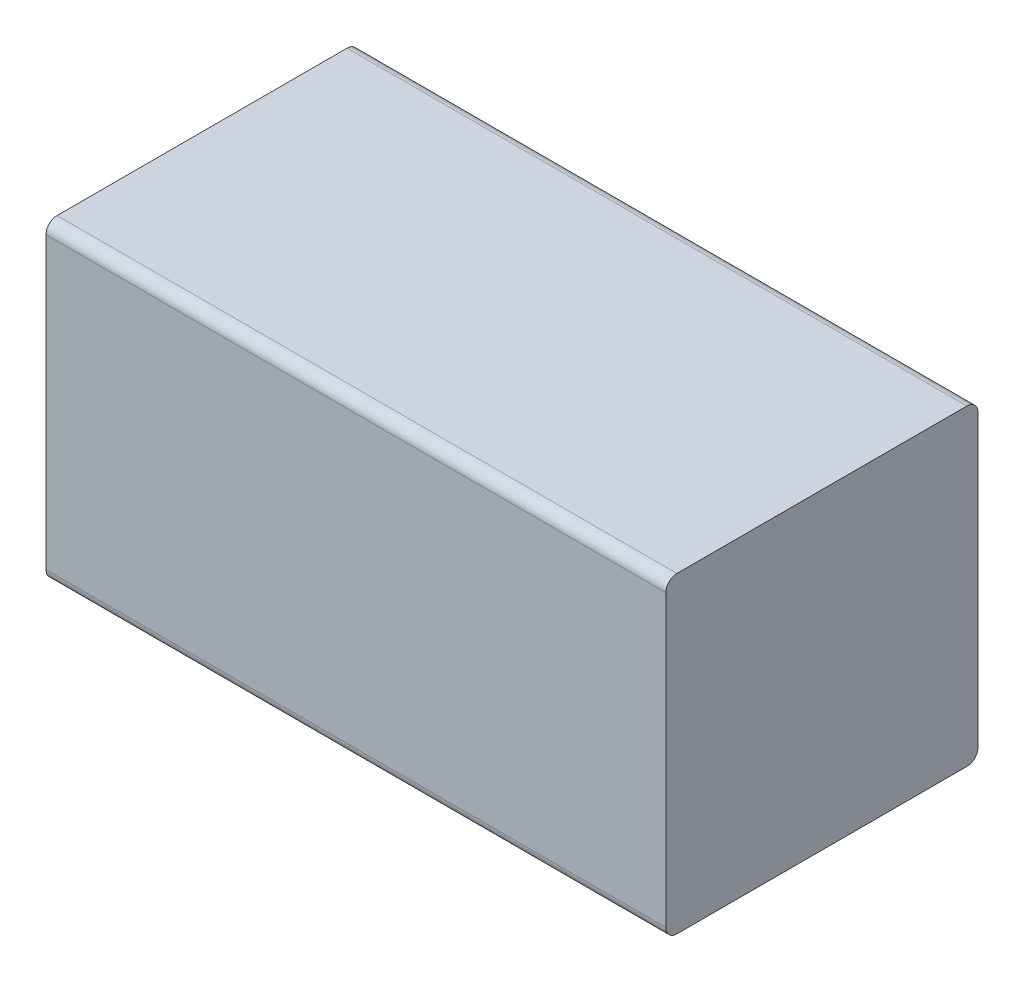
ISO-10303-21;
HEADER;
FILE_DESCRIPTION(('STEP AP214'),'2;1');
FILE_NAME('part.step','',(''),(''),'','','');
FILE_SCHEMA(('AUTOMOTIVE_DESIGN { 1 0 10303 214 1 1 1 1 }'));
ENDSEC;
DATA;
#1=APPLICATION_CONTEXT('core data for automotive mechanical design processes');
#2=APPLICATION_PROTOCOL_DEFINITION('international standard','automotive_design',2000,#1);
#3=PRODUCT_CONTEXT('',#1,'mechanical');
#4=PRODUCT('Part','Part','',(#3));
#5=PRODUCT_RELATED_PRODUCT_CATEGORY('part','',(#4));
#6=PRODUCT_DEFINITION_FORMATION('','',#4);
#7=PRODUCT_DEFINITION_CONTEXT('part definition',#1,'design');
#8=PRODUCT_DEFINITION('design','',#6,#7);
#9=PRODUCT_DEFINITION_SHAPE('','',#8);
#10=(LENGTH_UNIT() NAMED_UNIT(*) SI_UNIT(.MILLI.,.METRE.));
#11=(NAMED_UNIT(*) PLANE_ANGLE_UNIT() SI_UNIT($,.RADIAN.));
#12=(NAMED_UNIT(*) SI_UNIT($,.STERADIAN.) SOLID_ANGLE_UNIT());
#13=UNCERTAINTY_MEASURE_WITH_UNIT(LENGTH_MEASURE(1.E-05),#10,'distance_accuracy_value','');
#14=(GEOMETRIC_REPRESENTATION_CONTEXT(3) GLOBAL_UNCERTAINTY_ASSIGNED_CONTEXT((#13)) GLOBAL_UNIT_ASSIGNED_CONTEXT((#10,
#11,#12)) REPRESENTATION_CONTEXT('',''));
#15=CARTESIAN_POINT('',(0.,0.,0.));
#16=DIRECTION('',(0.,0.,1.));
#17=DIRECTION('',(1.,0.,0.));
#18=AXIS2_PLACEMENT_3D('',#15,#16,#17);
#19=CARTESIAN_POINT('',(-56.,56.4,28.2));
#20=DIRECTION('',(1.,0.,0.));
#21=DIRECTION('',(0.,0.,-1.));
#22=AXIS2_PLACEMENT_3D('',#19,#20,#21);
#23=PLANE('',#22);
#24=CARTESIAN_POINT('',(-56.,51.7,-23.5));
#25=DIRECTION('',(-1.,0.,0.));
#26=DIRECTION('',(0.,0.,1.));
#27=AXIS2_PLACEMENT_3D('',#24,#25,#26);
#28=CIRCLE('',#27,2.49999999999999);
#29=CARTESIAN_POINT('',(-56.,51.7,-21.));
#30=VERTEX_POINT('',#29);
#31=EDGE_CURVE('E264',#30,#30,#28,.T.);
#32=ORIENTED_EDGE('',*,*,#31,.F.);
#33=EDGE_LOOP('',(#32));
#34=FACE_BOUND('',#33,.T.);
#35=CARTESIAN_POINT('',(-56.,51.7,23.5));
#36=DIRECTION('',(-1.,0.,0.));
#37=DIRECTION('',(0.,0.,1.));
#38=AXIS2_PLACEMENT_3D('',#35,#36,#37);
#39=CIRCLE('',#38,2.49999999999999);
#40=CARTESIAN_POINT('',(-56.,51.7,26.));
#41=VERTEX_POINT('',#40);
#42=EDGE_CURVE('E266',#41,#41,#39,.T.);
#43=ORIENTED_EDGE('',*,*,#42,.F.);
#44=EDGE_LOOP('',(#43));
#45=FACE_BOUND('',#44,.T.);
#46=CARTESIAN_POINT('',(-56.,4.70000003606839,23.5018413119319));
#47=DIRECTION('',(-1.,0.,0.));
#48=DIRECTION('',(0.,0.,1.));
#49=AXIS2_PLACEMENT_3D('',#46,#47,#48);
#50=CIRCLE('',#49,2.49999999999999);
#51=CARTESIAN_POINT('',(-56.,4.70000003606839,26.0018413119319));
#52=VERTEX_POINT('',#51);
#53=EDGE_CURVE('E274',#52,#52,#50,.T.);
#54=ORIENTED_EDGE('',*,*,#53,.F.);
#55=EDGE_LOOP('',(#54));
#56=FACE_BOUND('',#55,.T.);
#57=CARTESIAN_POINT('',(-56.,28.2,0.));
#58=DIRECTION('',(1.,0.,0.));
#59=DIRECTION('',(0.,0.,-1.));
#60=AXIS2_PLACEMENT_3D('',#57,#58,#59);
#61=CIRCLE('',#60,4.);
#62=CARTESIAN_POINT('',(-56.,28.2,-4.));
#63=VERTEX_POINT('',#62);
#64=EDGE_CURVE('E12',#63,#63,#61,.F.);
#65=ORIENTED_EDGE('',*,*,#64,.F.);
#66=EDGE_LOOP('',(#65));
#67=FACE_BOUND('',#66,.T.);
#68=DIRECTION('',(0.,0.,1.));
#69=VECTOR('',#68,1.);
#70=CARTESIAN_POINT('',(-56.,56.4,28.2));
#71=LINE('',#70,#69);
#72=CARTESIAN_POINT('',(-56.,56.4,-26.2));
#73=VERTEX_POINT('',#72);
#74=CARTESIAN_POINT('',(-56.,56.4,26.2));
#75=VERTEX_POINT('',#74);
#76=EDGE_CURVE('E115',#73,#75,#71,.T.);
#77=ORIENTED_EDGE('',*,*,#76,.F.);
#78=CARTESIAN_POINT('',(-56.,54.4,-26.2));
#79=DIRECTION('',(1.,0.,0.));
#80=DIRECTION('',(0.,0.,-1.));
#81=AXIS2_PLACEMENT_3D('',#78,#79,#80);
#82=CIRCLE('',#81,2.);
#83=CARTESIAN_POINT('',(-56.,54.4,-28.2));
#84=VERTEX_POINT('',#83);
#85=EDGE_CURVE('E152',#73,#84,#82,.F.);
#86=ORIENTED_EDGE('',*,*,#85,.T.);
#87=DIRECTION('',(0.,-1.,0.));
#88=VECTOR('',#87,1.);
#89=CARTESIAN_POINT('',(-56.,56.4,-28.2));
#90=LINE('',#89,#88);
#91=CARTESIAN_POINT('',(-56.,2.,-28.2));
#92=VERTEX_POINT('',#91);
#93=EDGE_CURVE('E140',#84,#92,#90,.T.);
#94=ORIENTED_EDGE('',*,*,#93,.T.);
#95=CARTESIAN_POINT('',(-56.,2.,-26.2));
#96=DIRECTION('',(1.,0.,0.));
#97=DIRECTION('',(0.,0.,-1.));
#98=AXIS2_PLACEMENT_3D('',#95,#96,#97);
#99=CIRCLE('',#98,2.);
#100=CARTESIAN_POINT('',(-56.,0.,-26.2));
#101=VERTEX_POINT('',#100);
#102=EDGE_CURVE('E150',#92,#101,#99,.F.);
#103=ORIENTED_EDGE('',*,*,#102,.T.);
#104=DIRECTION('',(0.,0.,1.));
#105=VECTOR('',#104,1.);
#106=CARTESIAN_POINT('',(-56.,0.,28.2));
#107=LINE('',#106,#105);
#108=CARTESIAN_POINT('',(-56.,0.,26.2));
#109=VERTEX_POINT('',#108);
#110=EDGE_CURVE('E123',#101,#109,#107,.T.);
#111=ORIENTED_EDGE('',*,*,#110,.T.);
#112=CARTESIAN_POINT('',(-56.,2.,26.2));
#113=DIRECTION('',(1.,0.,0.));
#114=DIRECTION('',(0.,0.,-1.));
#115=AXIS2_PLACEMENT_3D('',#112,#113,#114);
#116=CIRCLE('',#115,2.);
#117=CARTESIAN_POINT('',(-56.,2.,28.2));
#118=VERTEX_POINT('',#117);
#119=EDGE_CURVE('E148',#109,#118,#116,.F.);
#120=ORIENTED_EDGE('',*,*,#119,.T.);
#121=DIRECTION('',(0.,-1.,0.));
#122=VECTOR('',#121,1.);
#123=CARTESIAN_POINT('',(-56.,56.4,28.2));
#124=LINE('',#123,#122);
#125=CARTESIAN_POINT('',(-56.,54.4,28.2));
#126=VERTEX_POINT('',#125);
#127=EDGE_CURVE('E137',#126,#118,#124,.T.);
#128=ORIENTED_EDGE('',*,*,#127,.F.);
#129=CARTESIAN_POINT('',(-56.,54.4,26.2));
#130=DIRECTION('',(1.,0.,0.));
#131=DIRECTION('',(0.,0.,-1.));
#132=AXIS2_PLACEMENT_3D('',#129,#130,#131);
#133=CIRCLE('',#132,2.);
#134=EDGE_CURVE('E146',#126,#75,#133,.F.);
#135=ORIENTED_EDGE('',*,*,#134,.T.);
#136=EDGE_LOOP('',(#77,#86,#94,#103,#111,#120,#128,#135));
#137=FACE_BOUND('',#136,.T.);
#138=CARTESIAN_POINT('',(-56.,4.70000003606839,-23.4981586880681));
#139=DIRECTION('',(-1.,0.,0.));
#140=DIRECTION('',(0.,0.,1.));
#141=AXIS2_PLACEMENT_3D('',#138,#139,#140);
#142=CIRCLE('',#141,2.49999999999999);
#143=CARTESIAN_POINT('',(-56.,4.70000003606839,-20.9981586880681));
#144=VERTEX_POINT('',#143);
#145=EDGE_CURVE('E280',#144,#144,#142,.T.);
#146=ORIENTED_EDGE('',*,*,#145,.F.);
#147=EDGE_LOOP('',(#146));
#148=FACE_BOUND('',#147,.T.);
#149=ADVANCED_FACE('F34',(#34,#45,#56,#67,#137,#148),#23,.F.);
#150=CARTESIAN_POINT('',(56.,56.4,28.2));
#151=DIRECTION('',(-1.,0.,0.));
#152=DIRECTION('',(0.,0.,1.));
#153=AXIS2_PLACEMENT_3D('',#150,#151,#152);
#154=PLANE('',#153);
#155=DIRECTION('',(0.,-1.,0.));
#156=VECTOR('',#155,1.);
#157=CARTESIAN_POINT('',(56.,56.4,-28.2));
#158=LINE('',#157,#156);
#159=CARTESIAN_POINT('',(56.,54.4,-28.2));
#160=VERTEX_POINT('',#159);
#161=CARTESIAN_POINT('',(56.,2.,-28.2));
#162=VERTEX_POINT('',#161);
#163=EDGE_CURVE('E117',#160,#162,#158,.T.);
#164=ORIENTED_EDGE('',*,*,#163,.F.);
#165=CARTESIAN_POINT('',(56.,54.4,-26.2));
#166=DIRECTION('',(-1.,0.,0.));
#167=DIRECTION('',(0.,0.,1.));
#168=AXIS2_PLACEMENT_3D('',#165,#166,#167);
#169=CIRCLE('',#168,2.);
#170=CARTESIAN_POINT('',(56.,56.4,-26.2));
#171=VERTEX_POINT('',#170);
#172=EDGE_CURVE('E122',#160,#171,#169,.F.);
#173=ORIENTED_EDGE('',*,*,#172,.T.);
#174=DIRECTION('',(0.,0.,-1.));
#175=VECTOR('',#174,1.);
#176=CARTESIAN_POINT('',(56.,56.4,28.2));
#177=LINE('',#176,#175);
#178=CARTESIAN_POINT('',(56.,56.4,26.2));
#179=VERTEX_POINT('',#178);
#180=EDGE_CURVE('E112',#179,#171,#177,.T.);
#181=ORIENTED_EDGE('',*,*,#180,.F.);
#182=CARTESIAN_POINT('',(56.,54.4,26.2));
#183=DIRECTION('',(-1.,0.,0.));
#184=DIRECTION('',(0.,0.,1.));
#185=AXIS2_PLACEMENT_3D('',#182,#183,#184);
#186=CIRCLE('',#185,2.);
#187=CARTESIAN_POINT('',(56.,54.4,28.2));
#188=VERTEX_POINT('',#187);
#189=EDGE_CURVE('E57',#179,#188,#186,.F.);
#190=ORIENTED_EDGE('',*,*,#189,.T.);
#191=DIRECTION('',(0.,-1.,0.));
#192=VECTOR('',#191,1.);
#193=CARTESIAN_POINT('',(56.,56.4,28.2));
#194=LINE('',#193,#192);
#195=CARTESIAN_POINT('',(56.,2.,28.2));
#196=VERTEX_POINT('',#195);
#197=EDGE_CURVE('E125',#188,#196,#194,.T.);
#198=ORIENTED_EDGE('',*,*,#197,.T.);
#199=CARTESIAN_POINT('',(56.,2.,26.2));
#200=DIRECTION('',(-1.,0.,0.));
#201=DIRECTION('',(0.,0.,1.));
#202=AXIS2_PLACEMENT_3D('',#199,#200,#201);
#203=CIRCLE('',#202,2.);
#204=CARTESIAN_POINT('',(56.,0.,26.2));
#205=VERTEX_POINT('',#204);
#206=EDGE_CURVE('E49',#196,#205,#203,.F.);
#207=ORIENTED_EDGE('',*,*,#206,.T.);
#208=DIRECTION('',(0.,0.,-1.));
#209=VECTOR('',#208,1.);
#210=CARTESIAN_POINT('',(56.,0.,28.2));
#211=LINE('',#210,#209);
#212=CARTESIAN_POINT('',(56.,0.,-26.2));
#213=VERTEX_POINT('',#212);
#214=EDGE_CURVE('E128',#205,#213,#211,.T.);
#215=ORIENTED_EDGE('',*,*,#214,.T.);
#216=CARTESIAN_POINT('',(56.,2.,-26.2));
#217=DIRECTION('',(-1.,0.,0.));
#218=DIRECTION('',(0.,0.,1.));
#219=AXIS2_PLACEMENT_3D('',#216,#217,#218);
#220=CIRCLE('',#219,2.);
#221=EDGE_CURVE('E159',#213,#162,#220,.F.);
#222=ORIENTED_EDGE('',*,*,#221,.T.);
#223=EDGE_LOOP('',(#164,#173,#181,#190,#198,#207,#215,#222));
#224=FACE_BOUND('',#223,.T.);
#225=ADVANCED_FACE('F120',(#224),#154,.F.);
#226=CARTESIAN_POINT('',(-56.,56.4,-28.2));
#227=DIRECTION('',(0.,0.,1.));
#228=DIRECTION('',(1.,0.,0.));
#229=AXIS2_PLACEMENT_3D('',#226,#227,#228);
#230=PLANE('',#229);
#231=ORIENTED_EDGE('',*,*,#93,.F.);
#232=DIRECTION('',(-1.,0.,0.));
#233=VECTOR('',#232,1.);
#234=CARTESIAN_POINT('',(-56.,54.4,-28.2));
#235=LINE('',#234,#233);
#236=EDGE_CURVE('E105',#84,#160,#235,.F.);
#237=ORIENTED_EDGE('',*,*,#236,.T.);
#238=ORIENTED_EDGE('',*,*,#163,.T.);
#239=DIRECTION('',(-1.,0.,0.));
#240=VECTOR('',#239,1.);
#241=CARTESIAN_POINT('',(-56.,2.,-28.2));
#242=LINE('',#241,#240);
#243=EDGE_CURVE('E154',#162,#92,#242,.T.);
#244=ORIENTED_EDGE('',*,*,#243,.T.);
#245=EDGE_LOOP('',(#231,#237,#238,#244));
#246=FACE_BOUND('',#245,.T.);
#247=ADVANCED_FACE('F184',(#246),#230,.F.);
#248=CARTESIAN_POINT('',(-56.,56.4,28.2));
#249=DIRECTION('',(0.,0.,-1.));
#250=DIRECTION('',(-1.,0.,0.));
#251=AXIS2_PLACEMENT_3D('',#248,#249,#250);
#252=PLANE('',#251);
#253=ORIENTED_EDGE('',*,*,#127,.T.);
#254=DIRECTION('',(1.,0.,0.));
#255=VECTOR('',#254,1.);
#256=CARTESIAN_POINT('',(56.,2.,28.2));
#257=LINE('',#256,#255);
#258=EDGE_CURVE('E42',#118,#196,#257,.T.);
#259=ORIENTED_EDGE('',*,*,#258,.T.);
#260=ORIENTED_EDGE('',*,*,#197,.F.);
#261=DIRECTION('',(1.,0.,0.));
#262=VECTOR('',#261,1.);
#263=CARTESIAN_POINT('',(-56.,54.4,28.2));
#264=LINE('',#263,#262);
#265=EDGE_CURVE('E104',#188,#126,#264,.F.);
#266=ORIENTED_EDGE('',*,*,#265,.T.);
#267=EDGE_LOOP('',(#253,#259,#260,#266));
#268=FACE_BOUND('',#267,.T.);
#269=ADVANCED_FACE('F167',(#268),#252,.F.);
#270=CARTESIAN_POINT('',(0.,56.4,0.));
#271=DIRECTION('',(0.,-1.,0.));
#272=DIRECTION('',(0.,0.,-1.));
#273=AXIS2_PLACEMENT_3D('',#270,#271,#272);
#274=PLANE('',#273);
#275=ORIENTED_EDGE('',*,*,#180,.T.);
#276=DIRECTION('',(-1.,0.,0.));
#277=VECTOR('',#276,1.);
#278=CARTESIAN_POINT('',(0.,56.4,-26.2));
#279=LINE('',#278,#277);
#280=EDGE_CURVE('E116',#171,#73,#279,.T.);
#281=ORIENTED_EDGE('',*,*,#280,.T.);
#282=ORIENTED_EDGE('',*,*,#76,.T.);
#283=DIRECTION('',(1.,0.,0.));
#284=VECTOR('',#283,1.);
#285=CARTESIAN_POINT('',(0.,56.4,26.2));
#286=LINE('',#285,#284);
#287=EDGE_CURVE('E103',#75,#179,#286,.T.);
#288=ORIENTED_EDGE('',*,*,#287,.T.);
#289=EDGE_LOOP('',(#275,#281,#282,#288));
#290=FACE_BOUND('',#289,.T.);
#291=ADVANCED_FACE('F110',(#290),#274,.F.);
#292=CARTESIAN_POINT('',(0.,0.,0.));
#293=DIRECTION('',(0.,-1.,0.));
#294=DIRECTION('',(0.,0.,-1.));
#295=AXIS2_PLACEMENT_3D('',#292,#293,#294);
#296=PLANE('',#295);
#297=ORIENTED_EDGE('',*,*,#110,.F.);
#298=DIRECTION('',(-1.,0.,0.));
#299=VECTOR('',#298,1.);
#300=CARTESIAN_POINT('',(56.,0.,-26.2));
#301=LINE('',#300,#299);
#302=EDGE_CURVE('E164',#101,#213,#301,.F.);
#303=ORIENTED_EDGE('',*,*,#302,.T.);
#304=ORIENTED_EDGE('',*,*,#214,.F.);
#305=DIRECTION('',(1.,0.,0.));
#306=VECTOR('',#305,1.);
#307=CARTESIAN_POINT('',(-56.,0.,26.2));
#308=LINE('',#307,#306);
#309=EDGE_CURVE('E162',#205,#109,#308,.F.);
#310=ORIENTED_EDGE('',*,*,#309,.T.);
#311=EDGE_LOOP('',(#297,#303,#304,#310));
#312=FACE_BOUND('',#311,.T.);
#313=ADVANCED_FACE('F174',(#312),#296,.T.);
#314=CARTESIAN_POINT('',(0.,54.4,-26.2));
#315=DIRECTION('',(-1.,0.,0.));
#316=DIRECTION('',(0.,0.,1.));
#317=AXIS2_PLACEMENT_3D('',#314,#315,#316);
#318=CYLINDRICAL_SURFACE('',#317,2.);
#319=ORIENTED_EDGE('',*,*,#172,.F.);
#320=ORIENTED_EDGE('',*,*,#236,.F.);
#321=ORIENTED_EDGE('',*,*,#85,.F.);
#322=ORIENTED_EDGE('',*,*,#280,.F.);
#323=EDGE_LOOP('',(#319,#320,#321,#322));
#324=FACE_BOUND('',#323,.T.);
#325=ADVANCED_FACE('F187',(#324),#318,.T.);
#326=CARTESIAN_POINT('',(-56.,2.,-26.2));
#327=DIRECTION('',(1.,0.,0.));
#328=DIRECTION('',(0.,0.,-1.));
#329=AXIS2_PLACEMENT_3D('',#326,#327,#328);
#330=CYLINDRICAL_SURFACE('',#329,2.);
#331=ORIENTED_EDGE('',*,*,#221,.F.);
#332=ORIENTED_EDGE('',*,*,#302,.F.);
#333=ORIENTED_EDGE('',*,*,#102,.F.);
#334=ORIENTED_EDGE('',*,*,#243,.F.);
#335=EDGE_LOOP('',(#331,#332,#333,#334));
#336=FACE_BOUND('',#335,.T.);
#337=ADVANCED_FACE('F180',(#336),#330,.T.);
#338=CARTESIAN_POINT('',(-56.,2.,26.2));
#339=DIRECTION('',(-1.,0.,0.));
#340=DIRECTION('',(0.,0.,1.));
#341=AXIS2_PLACEMENT_3D('',#338,#339,#340);
#342=CYLINDRICAL_SURFACE('',#341,2.);
#343=ORIENTED_EDGE('',*,*,#119,.F.);
#344=ORIENTED_EDGE('',*,*,#309,.F.);
#345=ORIENTED_EDGE('',*,*,#206,.F.);
#346=ORIENTED_EDGE('',*,*,#258,.F.);
#347=EDGE_LOOP('',(#343,#344,#345,#346));
#348=FACE_BOUND('',#347,.T.);
#349=ADVANCED_FACE('F176',(#348),#342,.T.);
#350=CARTESIAN_POINT('',(0.,54.4,26.2));
#351=DIRECTION('',(1.,0.,0.));
#352=DIRECTION('',(0.,0.,-1.));
#353=AXIS2_PLACEMENT_3D('',#350,#351,#352);
#354=CYLINDRICAL_SURFACE('',#353,2.);
#355=ORIENTED_EDGE('',*,*,#134,.F.);
#356=ORIENTED_EDGE('',*,*,#265,.F.);
#357=ORIENTED_EDGE('',*,*,#189,.F.);
#358=ORIENTED_EDGE('',*,*,#287,.F.);
#359=EDGE_LOOP('',(#355,#356,#357,#358));
#360=FACE_BOUND('',#359,.T.);
#361=ADVANCED_FACE('F36',(#360),#354,.T.);
#362=CARTESIAN_POINT('',(-76.6,28.2,0.));
#363=DIRECTION('',(1.,0.,0.));
#364=DIRECTION('',(0.,0.,-1.));
#365=AXIS2_PLACEMENT_3D('',#362,#363,#364);
#366=CYLINDRICAL_SURFACE('',#365,4.);
#367=CARTESIAN_POINT('',(-76.6,28.2,0.));
#368=DIRECTION('',(-1.,0.,0.));
#369=DIRECTION('',(0.,0.,1.));
#370=AXIS2_PLACEMENT_3D('',#367,#368,#369);
#371=CIRCLE('',#370,4.);
#372=CARTESIAN_POINT('',(-76.6,28.2,-4.));
#373=VERTEX_POINT('',#372);
#374=EDGE_CURVE('E131',#373,#373,#371,.T.);
#375=CARTESIAN_POINT('',(-76.6,28.2,-4.));
#376=CARTESIAN_POINT('',(-76.3854166666667,28.2,-4.));
#377=CARTESIAN_POINT('',(-76.1708333333333,28.2,-4.));
#378=CARTESIAN_POINT('',(-75.7416666666666,28.2,-4.));
#379=CARTESIAN_POINT('',(-75.5270833333333,28.2,-4.));
#380=CARTESIAN_POINT('',(-75.0979166666666,28.2,-4.));
#381=CARTESIAN_POINT('',(-74.8833333333333,28.2,-4.));
#382=CARTESIAN_POINT('',(-74.4541666666667,28.2,-4.));
#383=CARTESIAN_POINT('',(-74.2395833333333,28.2,-4.));
#384=CARTESIAN_POINT('',(-73.8104166666667,28.2,-4.));
#385=CARTESIAN_POINT('',(-73.5958333333333,28.2,-4.));
#386=CARTESIAN_POINT('',(-73.1666666666667,28.2,-4.));
#387=CARTESIAN_POINT('',(-72.9520833333333,28.2,-4.));
#388=CARTESIAN_POINT('',(-72.5229166666667,28.2,-4.));
#389=CARTESIAN_POINT('',(-72.3083333333333,28.2,-4.));
#390=CARTESIAN_POINT('',(-71.8791666666667,28.2,-4.));
#391=CARTESIAN_POINT('',(-71.6645833333333,28.2,-4.));
#392=CARTESIAN_POINT('',(-71.2354166666667,28.2,-4.));
#393=CARTESIAN_POINT('',(-71.0208333333333,28.2,-4.));
#394=CARTESIAN_POINT('',(-70.5916666666667,28.2,-4.));
#395=CARTESIAN_POINT('',(-70.3770833333333,28.2,-4.));
#396=CARTESIAN_POINT('',(-69.9479166666667,28.2,-4.));
#397=CARTESIAN_POINT('',(-69.7333333333333,28.2,-4.));
#398=CARTESIAN_POINT('',(-69.3041666666667,28.2,-4.));
#399=CARTESIAN_POINT('',(-69.0895833333333,28.2,-4.));
#400=CARTESIAN_POINT('',(-68.6604166666666,28.2,-4.));
#401=CARTESIAN_POINT('',(-68.4458333333333,28.2,-4.));
#402=CARTESIAN_POINT('',(-68.0166666666667,28.2,-4.));
#403=CARTESIAN_POINT('',(-67.8020833333333,28.2,-4.));
#404=CARTESIAN_POINT('',(-67.3729166666667,28.2,-4.));
#405=CARTESIAN_POINT('',(-67.1583333333333,28.2,-4.));
#406=CARTESIAN_POINT('',(-66.7291666666667,28.2,-4.));
#407=CARTESIAN_POINT('',(-66.5145833333333,28.2,-4.));
#408=CARTESIAN_POINT('',(-66.0854166666667,28.2,-4.));
#409=CARTESIAN_POINT('',(-65.8708333333333,28.2,-4.));
#410=CARTESIAN_POINT('',(-65.4416666666667,28.2,-4.));
#411=CARTESIAN_POINT('',(-65.2270833333333,28.2,-4.));
#412=CARTESIAN_POINT('',(-64.7979166666667,28.2,-4.));
#413=CARTESIAN_POINT('',(-64.5833333333333,28.2,-4.));
#414=CARTESIAN_POINT('',(-64.1541666666667,28.2,-4.));
#415=CARTESIAN_POINT('',(-63.9395833333333,28.2,-4.));
#416=CARTESIAN_POINT('',(-63.5104166666667,28.2,-4.));
#417=CARTESIAN_POINT('',(-63.2958333333333,28.2,-4.));
#418=CARTESIAN_POINT('',(-62.8666666666667,28.2,-4.));
#419=CARTESIAN_POINT('',(-62.6520833333333,28.2,-4.));
#420=CARTESIAN_POINT('',(-62.2229166666667,28.2,-4.));
#421=CARTESIAN_POINT('',(-62.0083333333333,28.2,-4.));
#422=CARTESIAN_POINT('',(-61.5791666666667,28.2,-4.));
#423=CARTESIAN_POINT('',(-61.3645833333333,28.2,-4.));
#424=CARTESIAN_POINT('',(-60.9354166666667,28.2,-4.));
#425=CARTESIAN_POINT('',(-60.7208333333333,28.2,-4.));
#426=CARTESIAN_POINT('',(-60.2916666666667,28.2,-4.));
#427=CARTESIAN_POINT('',(-60.0770833333333,28.2,-4.));
#428=CARTESIAN_POINT('',(-59.6479166666667,28.2,-4.));
#429=CARTESIAN_POINT('',(-59.4333333333333,28.2,-4.));
#430=CARTESIAN_POINT('',(-59.0041666666667,28.2,-4.));
#431=CARTESIAN_POINT('',(-58.7895833333333,28.2,-4.));
#432=CARTESIAN_POINT('',(-58.3604166666667,28.2,-4.));
#433=CARTESIAN_POINT('',(-58.1458333333333,28.2,-4.));
#434=CARTESIAN_POINT('',(-57.7166666666667,28.2,-4.));
#435=CARTESIAN_POINT('',(-57.5020833333333,28.2,-4.));
#436=CARTESIAN_POINT('',(-57.0729166666667,28.2,-4.));
#437=CARTESIAN_POINT('',(-56.8583333333333,28.2,-4.));
#438=CARTESIAN_POINT('',(-56.4291666666667,28.2,-4.));
#439=CARTESIAN_POINT('',(-56.2145833333333,28.2,-4.));
#440=CARTESIAN_POINT('',(-56.,28.2,-4.));
#441=B_SPLINE_CURVE_WITH_KNOTS('',3,(#375,#376,#377,#378,#379,#380,#381,#382,#383,#384,#385,
#386,#387,#388,#389,#390,#391,#392,#393,#394,#395,#396,#397,#398,#399,#400,#401,#402,#403,#404,
#405,#406,#407,#408,#409,#410,#411,#412,#413,#414,#415,#416,#417,#418,#419,#420,#421,#422,#423,
#424,#425,#426,#427,#428,#429,#430,#431,#432,#433,#434,#435,#436,#437,#438,#439,#440),
.UNSPECIFIED.,.F.,.F.,(4,2,2,2,2,2,2,2,2,2,2,2,2,2,2,2,2,2,2,2,2,2,2,2,2,2,2,2,2,2,2,2,4),(0.,
0.643750000000012,1.28750000000001,1.93125000000001,2.57500000000001,3.21875000000001,3.8625,
4.50625,5.15,5.79375,6.4375,7.08125,7.72500000000001,8.36875000000001,9.01250000000001,
9.65625000000001,10.3,10.94375,11.5875,12.23125,12.875,13.51875,14.1625,14.80625,15.45,16.09375,
16.7375,17.38125,18.025,18.66875,19.3125,19.95625,20.6),.UNSPECIFIED.);
#442=EDGE_CURVE('BSEAM218',#373,#63,#441,.T.);
#443=ORIENTED_EDGE('',*,*,#374,.F.);
#444=ORIENTED_EDGE('',*,*,#64,.T.);
#445=ORIENTED_EDGE('',*,*,#442,.T.);
#446=ORIENTED_EDGE('',*,*,#442,.F.);
#447=EDGE_LOOP('',(#443,#445,#444,#446));
#448=FACE_BOUND('',#447,.T.);
#449=ADVANCED_FACE('F218',(#448),#366,.T.);
#450=CARTESIAN_POINT('',(-76.6,28.2,0.));
#451=DIRECTION('',(-1.,0.,0.));
#452=DIRECTION('',(0.,0.,1.));
#453=AXIS2_PLACEMENT_3D('',#450,#451,#452);
#454=PLANE('',#453);
#455=ORIENTED_EDGE('',*,*,#374,.T.);
#456=EDGE_LOOP('',(#455));
#457=FACE_BOUND('',#456,.T.);
#458=ADVANCED_FACE('F221',(#457),#454,.T.);
#459=CARTESIAN_POINT('',(-40.,4.70000003606839,-23.4981586880681));
#460=DIRECTION('',(1.,0.,0.));
#461=DIRECTION('',(0.,0.,-1.));
#462=AXIS2_PLACEMENT_3D('',#459,#460,#461);
#463=PLANE('',#462);
#464=CARTESIAN_POINT('',(-40.,4.70000003606839,-23.4981586880681));
#465=DIRECTION('',(-1.,0.,0.));
#466=DIRECTION('',(0.,0.,1.));
#467=AXIS2_PLACEMENT_3D('',#464,#465,#466);
#468=CIRCLE('',#467,2.5);
#469=CARTESIAN_POINT('',(-40.,4.70000003606839,-20.9981586880681));
#470=VERTEX_POINT('',#469);
#471=EDGE_CURVE('E282',#470,#470,#468,.T.);
#472=ORIENTED_EDGE('',*,*,#471,.T.);
#473=EDGE_LOOP('',(#472));
#474=FACE_BOUND('',#473,.T.);
#475=ADVANCED_FACE('F225',(#474),#463,.F.);
#476=CARTESIAN_POINT('',(-56.,4.70000003606839,-23.4981586880681));
#477=DIRECTION('',(-1.,0.,0.));
#478=DIRECTION('',(0.,0.,1.));
#479=AXIS2_PLACEMENT_3D('',#476,#477,#478);
#480=CYLINDRICAL_SURFACE('',#479,2.49999999999999);
#481=ORIENTED_EDGE('',*,*,#471,.F.);
#482=EDGE_LOOP('',(#481));
#483=FACE_BOUND('',#482,.T.);
#484=ORIENTED_EDGE('',*,*,#145,.T.);
#485=EDGE_LOOP('',(#484));
#486=FACE_BOUND('',#485,.T.);
#487=ADVANCED_FACE('F229',(#483,#486),#480,.F.);
#488=CARTESIAN_POINT('',(-40.,4.70000003606839,23.5018413119319));
#489=DIRECTION('',(1.,0.,0.));
#490=DIRECTION('',(0.,0.,-1.));
#491=AXIS2_PLACEMENT_3D('',#488,#489,#490);
#492=PLANE('',#491);
#493=CARTESIAN_POINT('',(-40.,4.70000003606839,23.5018413119319));
#494=DIRECTION('',(-1.,0.,0.));
#495=DIRECTION('',(0.,0.,1.));
#496=AXIS2_PLACEMENT_3D('',#493,#494,#495);
#497=CIRCLE('',#496,2.5);
#498=CARTESIAN_POINT('',(-40.,4.70000003606839,26.0018413119319));
#499=VERTEX_POINT('',#498);
#500=EDGE_CURVE('E277',#499,#499,#497,.T.);
#501=ORIENTED_EDGE('',*,*,#500,.T.);
#502=EDGE_LOOP('',(#501));
#503=FACE_BOUND('',#502,.T.);
#504=ADVANCED_FACE('F233',(#503),#492,.F.);
#505=CARTESIAN_POINT('',(-56.,4.70000003606839,23.5018413119319));
#506=DIRECTION('',(-1.,0.,0.));
#507=DIRECTION('',(0.,0.,1.));
#508=AXIS2_PLACEMENT_3D('',#505,#506,#507);
#509=CYLINDRICAL_SURFACE('',#508,2.49999999999999);
#510=ORIENTED_EDGE('',*,*,#500,.F.);
#511=EDGE_LOOP('',(#510));
#512=FACE_BOUND('',#511,.T.);
#513=ORIENTED_EDGE('',*,*,#53,.T.);
#514=EDGE_LOOP('',(#513));
#515=FACE_BOUND('',#514,.T.);
#516=ADVANCED_FACE('F237',(#512,#515),#509,.F.);
#517=CARTESIAN_POINT('',(-40.,51.7,23.5));
#518=DIRECTION('',(1.,0.,0.));
#519=DIRECTION('',(0.,0.,-1.));
#520=AXIS2_PLACEMENT_3D('',#517,#518,#519);
#521=PLANE('',#520);
#522=CARTESIAN_POINT('',(-40.,51.7,23.5));
#523=DIRECTION('',(-1.,0.,0.));
#524=DIRECTION('',(0.,0.,1.));
#525=AXIS2_PLACEMENT_3D('',#522,#523,#524);
#526=CIRCLE('',#525,2.5);
#527=CARTESIAN_POINT('',(-40.,51.7,26.));
#528=VERTEX_POINT('',#527);
#529=EDGE_CURVE('E271',#528,#528,#526,.T.);
#530=ORIENTED_EDGE('',*,*,#529,.T.);
#531=EDGE_LOOP('',(#530));
#532=FACE_BOUND('',#531,.T.);
#533=ADVANCED_FACE('F241',(#532),#521,.F.);
#534=CARTESIAN_POINT('',(-56.,51.7,23.5));
#535=DIRECTION('',(-1.,0.,0.));
#536=DIRECTION('',(0.,0.,1.));
#537=AXIS2_PLACEMENT_3D('',#534,#535,#536);
#538=CYLINDRICAL_SURFACE('',#537,2.49999999999999);
#539=ORIENTED_EDGE('',*,*,#529,.F.);
#540=EDGE_LOOP('',(#539));
#541=FACE_BOUND('',#540,.T.);
#542=ORIENTED_EDGE('',*,*,#42,.T.);
#543=EDGE_LOOP('',(#542));
#544=FACE_BOUND('',#543,.T.);
#545=ADVANCED_FACE('F245',(#541,#544),#538,.F.);
#546=CARTESIAN_POINT('',(-40.,51.7,-23.5));
#547=DIRECTION('',(1.,0.,0.));
#548=DIRECTION('',(0.,0.,-1.));
#549=AXIS2_PLACEMENT_3D('',#546,#547,#548);
#550=PLANE('',#549);
#551=CARTESIAN_POINT('',(-40.,51.7,-23.5));
#552=DIRECTION('',(-1.,0.,0.));
#553=DIRECTION('',(0.,0.,1.));
#554=AXIS2_PLACEMENT_3D('',#551,#552,#553);
#555=CIRCLE('',#554,2.5);
#556=CARTESIAN_POINT('',(-40.,51.7,-21.));
#557=VERTEX_POINT('',#556);
#558=EDGE_CURVE('E262',#557,#557,#555,.T.);
#559=ORIENTED_EDGE('',*,*,#558,.T.);
#560=EDGE_LOOP('',(#559));
#561=FACE_BOUND('',#560,.T.);
#562=ADVANCED_FACE('F249',(#561),#550,.F.);
#563=CARTESIAN_POINT('',(-56.,51.7,-23.5));
#564=DIRECTION('',(-1.,0.,0.));
#565=DIRECTION('',(0.,0.,1.));
#566=AXIS2_PLACEMENT_3D('',#563,#564,#565);
#567=CYLINDRICAL_SURFACE('',#566,2.49999999999999);
#568=ORIENTED_EDGE('',*,*,#558,.F.);
#569=EDGE_LOOP('',(#568));
#570=FACE_BOUND('',#569,.T.);
#571=ORIENTED_EDGE('',*,*,#31,.T.);
#572=EDGE_LOOP('',(#571));
#573=FACE_BOUND('',#572,.T.);
#574=ADVANCED_FACE('F253',(#570,#573),#567,.F.);
#575=CLOSED_SHELL('',(#149,#225,#247,#269,#291,#313,#325,#337,#349,#361,#449,#458,#475,#487,
#504,#516,#533,#545,#562,#574));
#576=MANIFOLD_SOLID_BREP('B2',#575);
#577=ADVANCED_BREP_SHAPE_REPRESENTATION('',(#18,#576),#14);
#578=SHAPE_DEFINITION_REPRESENTATION(#9,#577);
ENDSEC;
END-ISO-10303-21;
